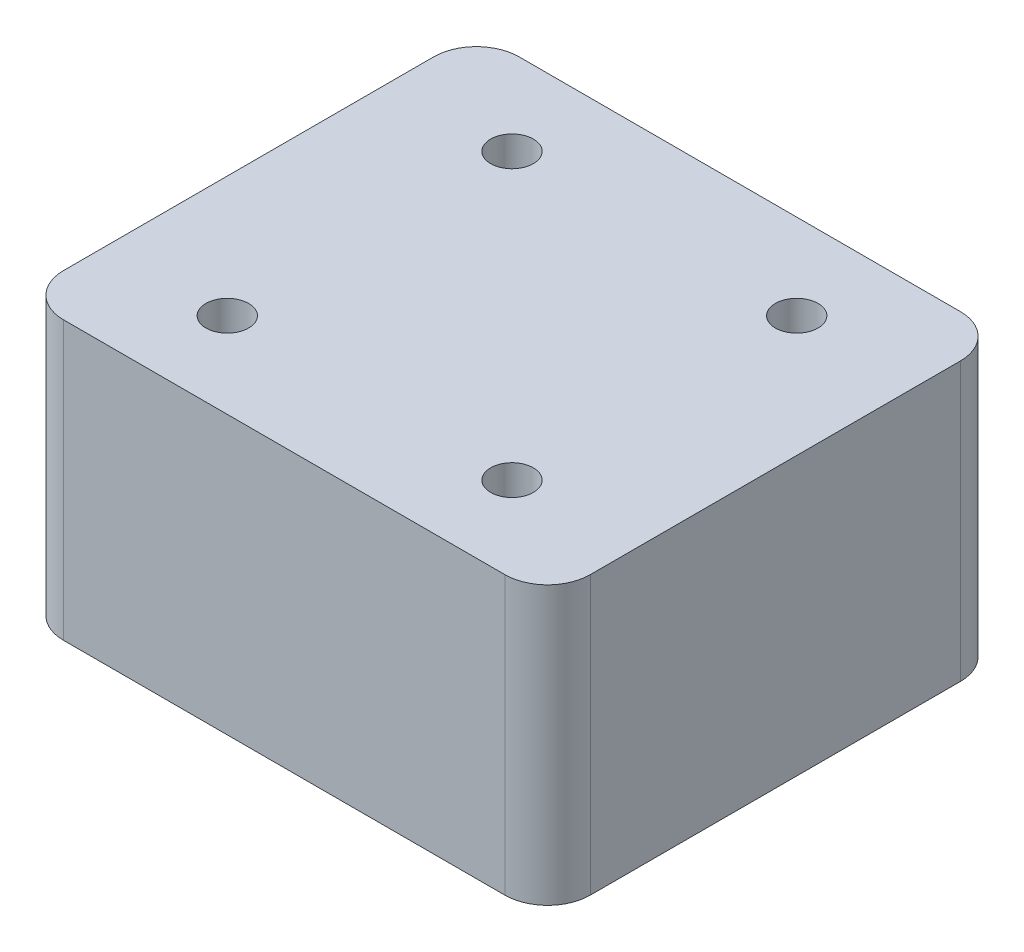
ISO-10303-21;
HEADER;
FILE_DESCRIPTION(('STEP AP214'),'2;1');
FILE_NAME('part.step','',(''),(''),'','','');
FILE_SCHEMA(('AUTOMOTIVE_DESIGN { 1 0 10303 214 1 1 1 1 }'));
ENDSEC;
DATA;
#1=APPLICATION_CONTEXT('core data for automotive mechanical design processes');
#2=APPLICATION_PROTOCOL_DEFINITION('international standard','automotive_design',2000,#1);
#3=PRODUCT_CONTEXT('',#1,'mechanical');
#4=PRODUCT('Part','Part','',(#3));
#5=PRODUCT_RELATED_PRODUCT_CATEGORY('part','',(#4));
#6=PRODUCT_DEFINITION_FORMATION('','',#4);
#7=PRODUCT_DEFINITION_CONTEXT('part definition',#1,'design');
#8=PRODUCT_DEFINITION('design','',#6,#7);
#9=PRODUCT_DEFINITION_SHAPE('','',#8);
#10=(LENGTH_UNIT() NAMED_UNIT(*) SI_UNIT(.MILLI.,.METRE.));
#11=(NAMED_UNIT(*) PLANE_ANGLE_UNIT() SI_UNIT($,.RADIAN.));
#12=(NAMED_UNIT(*) SI_UNIT($,.STERADIAN.) SOLID_ANGLE_UNIT());
#13=UNCERTAINTY_MEASURE_WITH_UNIT(LENGTH_MEASURE(1.E-05),#10,'distance_accuracy_value','');
#14=(GEOMETRIC_REPRESENTATION_CONTEXT(3) GLOBAL_UNCERTAINTY_ASSIGNED_CONTEXT((#13)) GLOBAL_UNIT_ASSIGNED_CONTEXT((#10,
#11,#12)) REPRESENTATION_CONTEXT('',''));
#15=CARTESIAN_POINT('',(0.,0.,0.));
#16=DIRECTION('',(0.,0.,1.));
#17=DIRECTION('',(1.,0.,0.));
#18=AXIS2_PLACEMENT_3D('',#15,#16,#17);
#19=CARTESIAN_POINT('',(-18.5,-19.5,16.));
#20=DIRECTION('',(0.,0.,1.));
#21=DIRECTION('',(1.,0.,0.));
#22=AXIS2_PLACEMENT_3D('',#19,#20,#21);
#23=PLANE('',#22);
#24=DIRECTION('',(1.,0.,0.));
#25=VECTOR('',#24,1.);
#26=CARTESIAN_POINT('',(-18.5,-19.5,16.));
#27=LINE('',#26,#25);
#28=CARTESIAN_POINT('',(-15.5,-19.5,16.));
#29=VERTEX_POINT('',#28);
#30=CARTESIAN_POINT('',(15.5,-19.5,16.));
#31=VERTEX_POINT('',#30);
#32=EDGE_CURVE('E139',#29,#31,#27,.T.);
#33=ORIENTED_EDGE('',*,*,#32,.T.);
#34=DIRECTION('',(0.,1.,0.));
#35=VECTOR('',#34,1.);
#36=CARTESIAN_POINT('',(15.5,-19.5,16.));
#37=LINE('',#36,#35);
#38=CARTESIAN_POINT('',(15.5,0.,16.));
#39=VERTEX_POINT('',#38);
#40=EDGE_CURVE('E11',#31,#39,#37,.T.);
#41=ORIENTED_EDGE('',*,*,#40,.T.);
#42=DIRECTION('',(1.,0.,0.));
#43=VECTOR('',#42,1.);
#44=CARTESIAN_POINT('',(-18.5,0.,16.));
#45=LINE('',#44,#43);
#46=CARTESIAN_POINT('',(-15.5,0.,16.));
#47=VERTEX_POINT('',#46);
#48=EDGE_CURVE('E142',#47,#39,#45,.T.);
#49=ORIENTED_EDGE('',*,*,#48,.F.);
#50=DIRECTION('',(0.,1.,0.));
#51=VECTOR('',#50,1.);
#52=CARTESIAN_POINT('',(-15.5,-19.5,16.));
#53=LINE('',#52,#51);
#54=EDGE_CURVE('E52',#47,#29,#53,.F.);
#55=ORIENTED_EDGE('',*,*,#54,.T.);
#56=EDGE_LOOP('',(#33,#41,#49,#55));
#57=FACE_BOUND('',#56,.T.);
#58=ADVANCED_FACE('F44',(#57),#23,.T.);
#59=CARTESIAN_POINT('',(-18.5,-19.5,16.));
#60=DIRECTION('',(1.,0.,0.));
#61=DIRECTION('',(0.,0.,-1.));
#62=AXIS2_PLACEMENT_3D('',#59,#60,#61);
#63=PLANE('',#62);
#64=DIRECTION('',(0.,0.,-1.));
#65=VECTOR('',#64,1.);
#66=CARTESIAN_POINT('',(-18.5,0.,16.));
#67=LINE('',#66,#65);
#68=CARTESIAN_POINT('',(-18.5,0.,13.));
#69=VERTEX_POINT('',#68);
#70=CARTESIAN_POINT('',(-18.5,0.,-13.));
#71=VERTEX_POINT('',#70);
#72=EDGE_CURVE('E140',#69,#71,#67,.T.);
#73=ORIENTED_EDGE('',*,*,#72,.T.);
#74=DIRECTION('',(0.,1.,0.));
#75=VECTOR('',#74,1.);
#76=CARTESIAN_POINT('',(-18.5,-19.5,-13.));
#77=LINE('',#76,#75);
#78=CARTESIAN_POINT('',(-18.5,-19.5,-13.));
#79=VERTEX_POINT('',#78);
#80=EDGE_CURVE('E116',#71,#79,#77,.F.);
#81=ORIENTED_EDGE('',*,*,#80,.T.);
#82=DIRECTION('',(0.,0.,-1.));
#83=VECTOR('',#82,1.);
#84=CARTESIAN_POINT('',(-18.5,-19.5,16.));
#85=LINE('',#84,#83);
#86=CARTESIAN_POINT('',(-18.5,-19.5,13.));
#87=VERTEX_POINT('',#86);
#88=EDGE_CURVE('E148',#87,#79,#85,.T.);
#89=ORIENTED_EDGE('',*,*,#88,.F.);
#90=DIRECTION('',(0.,1.,0.));
#91=VECTOR('',#90,1.);
#92=CARTESIAN_POINT('',(-18.5,0.,13.));
#93=LINE('',#92,#91);
#94=EDGE_CURVE('E125',#87,#69,#93,.T.);
#95=ORIENTED_EDGE('',*,*,#94,.T.);
#96=EDGE_LOOP('',(#73,#81,#89,#95));
#97=FACE_BOUND('',#96,.T.);
#98=ADVANCED_FACE('F185',(#97),#63,.F.);
#99=CARTESIAN_POINT('',(-18.5,-19.5,-16.));
#100=DIRECTION('',(0.,0.,1.));
#101=DIRECTION('',(1.,0.,0.));
#102=AXIS2_PLACEMENT_3D('',#99,#100,#101);
#103=PLANE('',#102);
#104=DIRECTION('',(1.,0.,0.));
#105=VECTOR('',#104,1.);
#106=CARTESIAN_POINT('',(-18.5,-19.5,-16.));
#107=LINE('',#106,#105);
#108=CARTESIAN_POINT('',(-15.5,-19.5,-16.));
#109=VERTEX_POINT('',#108);
#110=CARTESIAN_POINT('',(15.5,-19.5,-16.));
#111=VERTEX_POINT('',#110);
#112=EDGE_CURVE('E134',#109,#111,#107,.T.);
#113=ORIENTED_EDGE('',*,*,#112,.F.);
#114=DIRECTION('',(0.,1.,0.));
#115=VECTOR('',#114,1.);
#116=CARTESIAN_POINT('',(-15.5,-19.5,-16.));
#117=LINE('',#116,#115);
#118=CARTESIAN_POINT('',(-15.5,0.,-16.));
#119=VERTEX_POINT('',#118);
#120=EDGE_CURVE('E119',#109,#119,#117,.T.);
#121=ORIENTED_EDGE('',*,*,#120,.T.);
#122=DIRECTION('',(1.,0.,0.));
#123=VECTOR('',#122,1.);
#124=CARTESIAN_POINT('',(-18.5,0.,-16.));
#125=LINE('',#124,#123);
#126=CARTESIAN_POINT('',(15.5,0.,-16.));
#127=VERTEX_POINT('',#126);
#128=EDGE_CURVE('E129',#119,#127,#125,.T.);
#129=ORIENTED_EDGE('',*,*,#128,.T.);
#130=DIRECTION('',(0.,1.,0.));
#131=VECTOR('',#130,1.);
#132=CARTESIAN_POINT('',(15.5,-19.5,-16.));
#133=LINE('',#132,#131);
#134=EDGE_CURVE('E135',#127,#111,#133,.F.);
#135=ORIENTED_EDGE('',*,*,#134,.T.);
#136=EDGE_LOOP('',(#113,#121,#129,#135));
#137=FACE_BOUND('',#136,.T.);
#138=ADVANCED_FACE('F126',(#137),#103,.F.);
#139=CARTESIAN_POINT('',(18.5,-19.5,16.));
#140=DIRECTION('',(1.,0.,0.));
#141=DIRECTION('',(0.,0.,-1.));
#142=AXIS2_PLACEMENT_3D('',#139,#140,#141);
#143=PLANE('',#142);
#144=DIRECTION('',(0.,0.,-1.));
#145=VECTOR('',#144,1.);
#146=CARTESIAN_POINT('',(18.5,-19.5,16.));
#147=LINE('',#146,#145);
#148=CARTESIAN_POINT('',(18.5,-19.5,13.));
#149=VERTEX_POINT('',#148);
#150=CARTESIAN_POINT('',(18.5,-19.5,-13.));
#151=VERTEX_POINT('',#150);
#152=EDGE_CURVE('E177',#149,#151,#147,.T.);
#153=ORIENTED_EDGE('',*,*,#152,.T.);
#154=DIRECTION('',(0.,1.,0.));
#155=VECTOR('',#154,1.);
#156=CARTESIAN_POINT('',(18.5,0.,-13.));
#157=LINE('',#156,#155);
#158=CARTESIAN_POINT('',(18.5,0.,-13.));
#159=VERTEX_POINT('',#158);
#160=EDGE_CURVE('E162',#151,#159,#157,.T.);
#161=ORIENTED_EDGE('',*,*,#160,.T.);
#162=DIRECTION('',(0.,0.,-1.));
#163=VECTOR('',#162,1.);
#164=CARTESIAN_POINT('',(18.5,0.,16.));
#165=LINE('',#164,#163);
#166=CARTESIAN_POINT('',(18.5,0.,13.));
#167=VERTEX_POINT('',#166);
#168=EDGE_CURVE('E137',#167,#159,#165,.T.);
#169=ORIENTED_EDGE('',*,*,#168,.F.);
#170=DIRECTION('',(0.,1.,0.));
#171=VECTOR('',#170,1.);
#172=CARTESIAN_POINT('',(18.5,-19.5,13.));
#173=LINE('',#172,#171);
#174=EDGE_CURVE('E70',#167,#149,#173,.F.);
#175=ORIENTED_EDGE('',*,*,#174,.T.);
#176=EDGE_LOOP('',(#153,#161,#169,#175));
#177=FACE_BOUND('',#176,.T.);
#178=ADVANCED_FACE('F244',(#177),#143,.T.);
#179=CARTESIAN_POINT('',(0.,-19.5,0.));
#180=DIRECTION('',(0.,1.,0.));
#181=DIRECTION('',(0.,0.,1.));
#182=AXIS2_PLACEMENT_3D('',#179,#180,#181);
#183=PLANE('',#182);
#184=ORIENTED_EDGE('',*,*,#88,.T.);
#185=CARTESIAN_POINT('',(-15.5,-19.5,-13.));
#186=DIRECTION('',(0.,1.,0.));
#187=DIRECTION('',(0.,0.,1.));
#188=AXIS2_PLACEMENT_3D('',#185,#186,#187);
#189=CIRCLE('',#188,3.);
#190=EDGE_CURVE('E159',#79,#109,#189,.F.);
#191=ORIENTED_EDGE('',*,*,#190,.T.);
#192=ORIENTED_EDGE('',*,*,#112,.T.);
#193=CARTESIAN_POINT('',(15.5,-19.5,-13.));
#194=DIRECTION('',(0.,1.,0.));
#195=DIRECTION('',(0.,0.,1.));
#196=AXIS2_PLACEMENT_3D('',#193,#194,#195);
#197=CIRCLE('',#196,3.);
#198=EDGE_CURVE('E58',#111,#151,#197,.F.);
#199=ORIENTED_EDGE('',*,*,#198,.T.);
#200=ORIENTED_EDGE('',*,*,#152,.F.);
#201=CARTESIAN_POINT('',(15.5,-19.5,13.));
#202=DIRECTION('',(0.,1.,0.));
#203=DIRECTION('',(0.,0.,1.));
#204=AXIS2_PLACEMENT_3D('',#201,#202,#203);
#205=CIRCLE('',#204,3.);
#206=EDGE_CURVE('E160',#149,#31,#205,.F.);
#207=ORIENTED_EDGE('',*,*,#206,.T.);
#208=ORIENTED_EDGE('',*,*,#32,.F.);
#209=CARTESIAN_POINT('',(-15.5,-19.5,13.));
#210=DIRECTION('',(0.,1.,0.));
#211=DIRECTION('',(0.,0.,1.));
#212=AXIS2_PLACEMENT_3D('',#209,#210,#211);
#213=CIRCLE('',#212,3.);
#214=EDGE_CURVE('E154',#29,#87,#213,.F.);
#215=ORIENTED_EDGE('',*,*,#214,.T.);
#216=EDGE_LOOP('',(#184,#191,#192,#199,#200,#207,#208,#215));
#217=FACE_BOUND('',#216,.T.);
#218=ADVANCED_FACE('F172',(#217),#183,.F.);
#219=CARTESIAN_POINT('',(0.,0.,0.));
#220=DIRECTION('',(0.,1.,0.));
#221=DIRECTION('',(0.,0.,1.));
#222=AXIS2_PLACEMENT_3D('',#219,#220,#221);
#223=PLANE('',#222);
#224=CARTESIAN_POINT('',(10.,0.,10.));
#225=DIRECTION('',(0.,1.,0.));
#226=DIRECTION('',(0.,0.,1.));
#227=AXIS2_PLACEMENT_3D('',#224,#225,#226);
#228=CIRCLE('',#227,1.5);
#229=CARTESIAN_POINT('',(10.,0.,11.5));
#230=VERTEX_POINT('',#229);
#231=EDGE_CURVE('E197',#230,#230,#228,.T.);
#232=ORIENTED_EDGE('',*,*,#231,.F.);
#233=EDGE_LOOP('',(#232));
#234=FACE_BOUND('',#233,.T.);
#235=CARTESIAN_POINT('',(10.,0.,-10.));
#236=DIRECTION('',(0.,1.,0.));
#237=DIRECTION('',(0.,0.,1.));
#238=AXIS2_PLACEMENT_3D('',#235,#236,#237);
#239=CIRCLE('',#238,1.5);
#240=CARTESIAN_POINT('',(10.,0.,-8.5));
#241=VERTEX_POINT('',#240);
#242=EDGE_CURVE('E201',#241,#241,#239,.T.);
#243=ORIENTED_EDGE('',*,*,#242,.F.);
#244=EDGE_LOOP('',(#243));
#245=FACE_BOUND('',#244,.T.);
#246=CARTESIAN_POINT('',(-10.,0.,-10.));
#247=DIRECTION('',(0.,1.,0.));
#248=DIRECTION('',(0.,0.,1.));
#249=AXIS2_PLACEMENT_3D('',#246,#247,#248);
#250=CIRCLE('',#249,1.5);
#251=CARTESIAN_POINT('',(-10.,0.,-8.5));
#252=VERTEX_POINT('',#251);
#253=EDGE_CURVE('E195',#252,#252,#250,.T.);
#254=ORIENTED_EDGE('',*,*,#253,.F.);
#255=EDGE_LOOP('',(#254));
#256=FACE_BOUND('',#255,.T.);
#257=CARTESIAN_POINT('',(-10.,0.,10.));
#258=DIRECTION('',(0.,1.,0.));
#259=DIRECTION('',(0.,0.,1.));
#260=AXIS2_PLACEMENT_3D('',#257,#258,#259);
#261=CIRCLE('',#260,1.5);
#262=CARTESIAN_POINT('',(-10.,0.,11.5));
#263=VERTEX_POINT('',#262);
#264=EDGE_CURVE('E183',#263,#263,#261,.T.);
#265=ORIENTED_EDGE('',*,*,#264,.F.);
#266=EDGE_LOOP('',(#265));
#267=FACE_BOUND('',#266,.T.);
#268=ORIENTED_EDGE('',*,*,#128,.F.);
#269=CARTESIAN_POINT('',(-15.5,0.,-13.));
#270=DIRECTION('',(0.,1.,0.));
#271=DIRECTION('',(0.,0.,1.));
#272=AXIS2_PLACEMENT_3D('',#269,#270,#271);
#273=CIRCLE('',#272,3.);
#274=EDGE_CURVE('E115',#119,#71,#273,.T.);
#275=ORIENTED_EDGE('',*,*,#274,.T.);
#276=ORIENTED_EDGE('',*,*,#72,.F.);
#277=CARTESIAN_POINT('',(-15.5,0.,13.));
#278=DIRECTION('',(0.,1.,0.));
#279=DIRECTION('',(0.,0.,1.));
#280=AXIS2_PLACEMENT_3D('',#277,#278,#279);
#281=CIRCLE('',#280,3.);
#282=EDGE_CURVE('E131',#69,#47,#281,.T.);
#283=ORIENTED_EDGE('',*,*,#282,.T.);
#284=ORIENTED_EDGE('',*,*,#48,.T.);
#285=CARTESIAN_POINT('',(15.5,0.,13.));
#286=DIRECTION('',(0.,1.,0.));
#287=DIRECTION('',(0.,0.,1.));
#288=AXIS2_PLACEMENT_3D('',#285,#286,#287);
#289=CIRCLE('',#288,3.);
#290=EDGE_CURVE('E149',#39,#167,#289,.T.);
#291=ORIENTED_EDGE('',*,*,#290,.T.);
#292=ORIENTED_EDGE('',*,*,#168,.T.);
#293=CARTESIAN_POINT('',(15.5,0.,-13.));
#294=DIRECTION('',(0.,1.,0.));
#295=DIRECTION('',(0.,0.,1.));
#296=AXIS2_PLACEMENT_3D('',#293,#294,#295);
#297=CIRCLE('',#296,3.);
#298=EDGE_CURVE('E122',#159,#127,#297,.T.);
#299=ORIENTED_EDGE('',*,*,#298,.T.);
#300=EDGE_LOOP('',(#268,#275,#276,#283,#284,#291,#292,#299));
#301=FACE_BOUND('',#300,.T.);
#302=ADVANCED_FACE('F132',(#234,#245,#256,#267,#301),#223,.T.);
#303=CARTESIAN_POINT('',(-10.,-10.,10.));
#304=DIRECTION('',(0.,1.,0.));
#305=DIRECTION('',(0.,0.,1.));
#306=AXIS2_PLACEMENT_3D('',#303,#304,#305);
#307=CYLINDRICAL_SURFACE('',#306,1.5);
#308=CARTESIAN_POINT('',(-10.,-10.,10.));
#309=DIRECTION('',(0.,1.,0.));
#310=DIRECTION('',(0.,0.,1.));
#311=AXIS2_PLACEMENT_3D('',#308,#309,#310);
#312=CIRCLE('',#311,1.5);
#313=CARTESIAN_POINT('',(-10.,-10.,11.5));
#314=VERTEX_POINT('',#313);
#315=EDGE_CURVE('E181',#314,#314,#312,.T.);
#316=ORIENTED_EDGE('',*,*,#315,.F.);
#317=EDGE_LOOP('',(#316));
#318=FACE_BOUND('',#317,.T.);
#319=ORIENTED_EDGE('',*,*,#264,.T.);
#320=EDGE_LOOP('',(#319));
#321=FACE_BOUND('',#320,.T.);
#322=ADVANCED_FACE('F216',(#318,#321),#307,.F.);
#323=CARTESIAN_POINT('',(-10.,-10.,10.));
#324=DIRECTION('',(0.,1.,0.));
#325=DIRECTION('',(0.,0.,1.));
#326=AXIS2_PLACEMENT_3D('',#323,#324,#325);
#327=PLANE('',#326);
#328=ORIENTED_EDGE('',*,*,#315,.T.);
#329=EDGE_LOOP('',(#328));
#330=FACE_BOUND('',#329,.T.);
#331=ADVANCED_FACE('F225',(#330),#327,.T.);
#332=CARTESIAN_POINT('',(-10.,-10.,-10.));
#333=DIRECTION('',(0.,1.,0.));
#334=DIRECTION('',(0.,0.,1.));
#335=AXIS2_PLACEMENT_3D('',#332,#333,#334);
#336=CYLINDRICAL_SURFACE('',#335,1.5);
#337=CARTESIAN_POINT('',(-10.,-10.,-10.));
#338=DIRECTION('',(0.,1.,0.));
#339=DIRECTION('',(0.,0.,1.));
#340=AXIS2_PLACEMENT_3D('',#337,#338,#339);
#341=CIRCLE('',#340,1.5);
#342=CARTESIAN_POINT('',(-10.,-10.,-8.5));
#343=VERTEX_POINT('',#342);
#344=EDGE_CURVE('E206',#343,#343,#341,.T.);
#345=ORIENTED_EDGE('',*,*,#344,.F.);
#346=EDGE_LOOP('',(#345));
#347=FACE_BOUND('',#346,.T.);
#348=ORIENTED_EDGE('',*,*,#253,.T.);
#349=EDGE_LOOP('',(#348));
#350=FACE_BOUND('',#349,.T.);
#351=ADVANCED_FACE('F215',(#347,#350),#336,.F.);
#352=CARTESIAN_POINT('',(-10.,-10.,-10.));
#353=DIRECTION('',(0.,1.,0.));
#354=DIRECTION('',(0.,0.,1.));
#355=AXIS2_PLACEMENT_3D('',#352,#353,#354);
#356=PLANE('',#355);
#357=ORIENTED_EDGE('',*,*,#344,.T.);
#358=EDGE_LOOP('',(#357));
#359=FACE_BOUND('',#358,.T.);
#360=ADVANCED_FACE('F311',(#359),#356,.T.);
#361=CARTESIAN_POINT('',(10.,-10.,-10.));
#362=DIRECTION('',(0.,1.,0.));
#363=DIRECTION('',(0.,0.,1.));
#364=AXIS2_PLACEMENT_3D('',#361,#362,#363);
#365=CYLINDRICAL_SURFACE('',#364,1.5);
#366=CARTESIAN_POINT('',(10.,-10.,-10.));
#367=DIRECTION('',(0.,1.,0.));
#368=DIRECTION('',(0.,0.,1.));
#369=AXIS2_PLACEMENT_3D('',#366,#367,#368);
#370=CIRCLE('',#369,1.5);
#371=CARTESIAN_POINT('',(10.,-10.,-8.5));
#372=VERTEX_POINT('',#371);
#373=EDGE_CURVE('E199',#372,#372,#370,.T.);
#374=ORIENTED_EDGE('',*,*,#373,.F.);
#375=EDGE_LOOP('',(#374));
#376=FACE_BOUND('',#375,.T.);
#377=ORIENTED_EDGE('',*,*,#242,.T.);
#378=EDGE_LOOP('',(#377));
#379=FACE_BOUND('',#378,.T.);
#380=ADVANCED_FACE('F302',(#376,#379),#365,.F.);
#381=CARTESIAN_POINT('',(10.,-10.,-10.));
#382=DIRECTION('',(0.,1.,0.));
#383=DIRECTION('',(0.,0.,1.));
#384=AXIS2_PLACEMENT_3D('',#381,#382,#383);
#385=PLANE('',#384);
#386=ORIENTED_EDGE('',*,*,#373,.T.);
#387=EDGE_LOOP('',(#386));
#388=FACE_BOUND('',#387,.T.);
#389=ADVANCED_FACE('F291',(#388),#385,.T.);
#390=CARTESIAN_POINT('',(10.,-10.,10.));
#391=DIRECTION('',(0.,1.,0.));
#392=DIRECTION('',(0.,0.,1.));
#393=AXIS2_PLACEMENT_3D('',#390,#391,#392);
#394=CYLINDRICAL_SURFACE('',#393,1.5);
#395=CARTESIAN_POINT('',(10.,-10.,10.));
#396=DIRECTION('',(0.,1.,0.));
#397=DIRECTION('',(0.,0.,1.));
#398=AXIS2_PLACEMENT_3D('',#395,#396,#397);
#399=CIRCLE('',#398,1.5);
#400=CARTESIAN_POINT('',(10.,-10.,11.5));
#401=VERTEX_POINT('',#400);
#402=EDGE_CURVE('E193',#401,#401,#399,.T.);
#403=ORIENTED_EDGE('',*,*,#402,.F.);
#404=EDGE_LOOP('',(#403));
#405=FACE_BOUND('',#404,.T.);
#406=ORIENTED_EDGE('',*,*,#231,.T.);
#407=EDGE_LOOP('',(#406));
#408=FACE_BOUND('',#407,.T.);
#409=ADVANCED_FACE('F285',(#405,#408),#394,.F.);
#410=CARTESIAN_POINT('',(10.,-10.,10.));
#411=DIRECTION('',(0.,1.,0.));
#412=DIRECTION('',(0.,0.,1.));
#413=AXIS2_PLACEMENT_3D('',#410,#411,#412);
#414=PLANE('',#413);
#415=ORIENTED_EDGE('',*,*,#402,.T.);
#416=EDGE_LOOP('',(#415));
#417=FACE_BOUND('',#416,.T.);
#418=ADVANCED_FACE('F246',(#417),#414,.T.);
#419=CARTESIAN_POINT('',(-15.5,-19.5,-13.));
#420=DIRECTION('',(0.,1.,0.));
#421=DIRECTION('',(0.,0.,1.));
#422=AXIS2_PLACEMENT_3D('',#419,#420,#421);
#423=CYLINDRICAL_SURFACE('',#422,3.);
#424=ORIENTED_EDGE('',*,*,#190,.F.);
#425=ORIENTED_EDGE('',*,*,#80,.F.);
#426=ORIENTED_EDGE('',*,*,#274,.F.);
#427=ORIENTED_EDGE('',*,*,#120,.F.);
#428=EDGE_LOOP('',(#424,#425,#426,#427));
#429=FACE_BOUND('',#428,.T.);
#430=ADVANCED_FACE('F113',(#429),#423,.T.);
#431=CARTESIAN_POINT('',(15.5,-19.5,-13.));
#432=DIRECTION('',(0.,-1.,0.));
#433=DIRECTION('',(0.,0.,-1.));
#434=AXIS2_PLACEMENT_3D('',#431,#432,#433);
#435=CYLINDRICAL_SURFACE('',#434,3.);
#436=ORIENTED_EDGE('',*,*,#198,.F.);
#437=ORIENTED_EDGE('',*,*,#134,.F.);
#438=ORIENTED_EDGE('',*,*,#298,.F.);
#439=ORIENTED_EDGE('',*,*,#160,.F.);
#440=EDGE_LOOP('',(#436,#437,#438,#439));
#441=FACE_BOUND('',#440,.T.);
#442=ADVANCED_FACE('F242',(#441),#435,.T.);
#443=CARTESIAN_POINT('',(15.5,-19.5,13.));
#444=DIRECTION('',(0.,1.,0.));
#445=DIRECTION('',(0.,0.,1.));
#446=AXIS2_PLACEMENT_3D('',#443,#444,#445);
#447=CYLINDRICAL_SURFACE('',#446,3.);
#448=ORIENTED_EDGE('',*,*,#206,.F.);
#449=ORIENTED_EDGE('',*,*,#174,.F.);
#450=ORIENTED_EDGE('',*,*,#290,.F.);
#451=ORIENTED_EDGE('',*,*,#40,.F.);
#452=EDGE_LOOP('',(#448,#449,#450,#451));
#453=FACE_BOUND('',#452,.T.);
#454=ADVANCED_FACE('F247',(#453),#447,.T.);
#455=CARTESIAN_POINT('',(-15.5,-19.5,13.));
#456=DIRECTION('',(0.,-1.,0.));
#457=DIRECTION('',(0.,0.,-1.));
#458=AXIS2_PLACEMENT_3D('',#455,#456,#457);
#459=CYLINDRICAL_SURFACE('',#458,3.);
#460=ORIENTED_EDGE('',*,*,#214,.F.);
#461=ORIENTED_EDGE('',*,*,#54,.F.);
#462=ORIENTED_EDGE('',*,*,#282,.F.);
#463=ORIENTED_EDGE('',*,*,#94,.F.);
#464=EDGE_LOOP('',(#460,#461,#462,#463));
#465=FACE_BOUND('',#464,.T.);
#466=ADVANCED_FACE('F50',(#465),#459,.T.);
#467=CLOSED_SHELL('',(#58,#98,#138,#178,#218,#302,#322,#331,#351,#360,#380,#389,#409,#418,#430,
#442,#454,#466));
#468=MANIFOLD_SOLID_BREP('B2',#467);
#469=ADVANCED_BREP_SHAPE_REPRESENTATION('',(#18,#468),#14);
#470=SHAPE_DEFINITION_REPRESENTATION(#9,#469);
ENDSEC;
END-ISO-10303-21;
